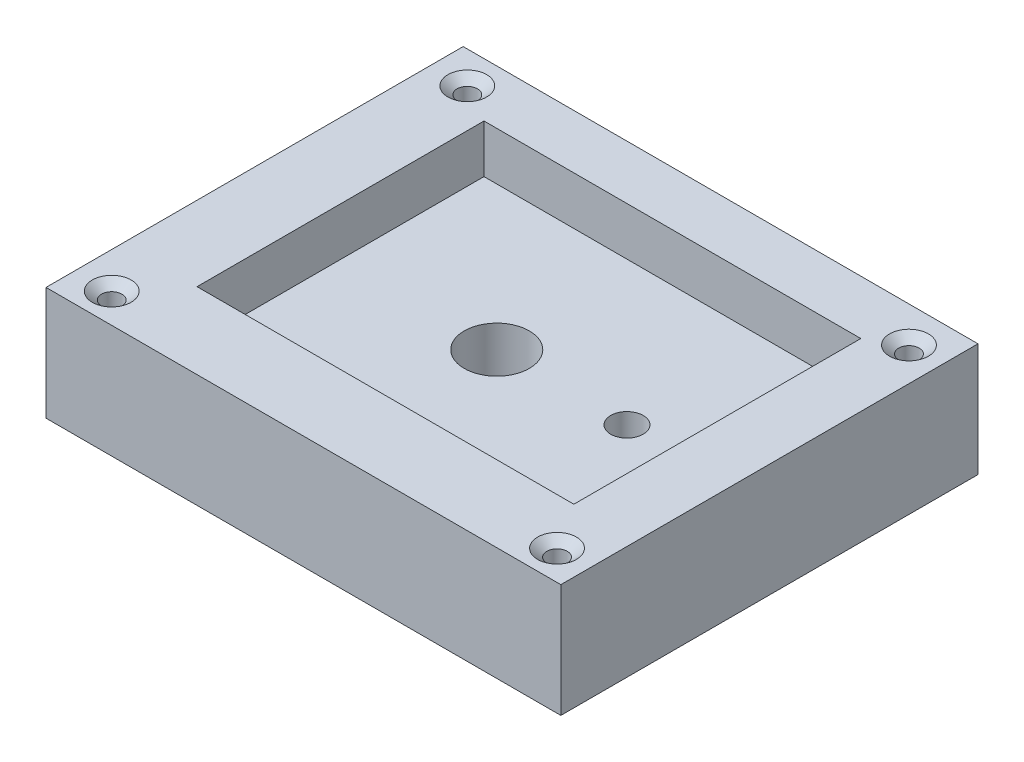
ISO-10303-21;
HEADER;
FILE_DESCRIPTION(('STEP AP214'),'2;1');
FILE_NAME('part.step','',(''),(''),'','','');
FILE_SCHEMA(('AUTOMOTIVE_DESIGN { 1 0 10303 214 1 1 1 1 }'));
ENDSEC;
DATA;
#1=APPLICATION_CONTEXT('core data for automotive mechanical design processes');
#2=APPLICATION_PROTOCOL_DEFINITION('international standard','automotive_design',2000,#1);
#3=PRODUCT_CONTEXT('',#1,'mechanical');
#4=PRODUCT('Part','Part','',(#3));
#5=PRODUCT_RELATED_PRODUCT_CATEGORY('part','',(#4));
#6=PRODUCT_DEFINITION_FORMATION('','',#4);
#7=PRODUCT_DEFINITION_CONTEXT('part definition',#1,'design');
#8=PRODUCT_DEFINITION('design','',#6,#7);
#9=PRODUCT_DEFINITION_SHAPE('','',#8);
#10=(LENGTH_UNIT() NAMED_UNIT(*) SI_UNIT(.MILLI.,.METRE.));
#11=(NAMED_UNIT(*) PLANE_ANGLE_UNIT() SI_UNIT($,.RADIAN.));
#12=(NAMED_UNIT(*) SI_UNIT($,.STERADIAN.) SOLID_ANGLE_UNIT());
#13=UNCERTAINTY_MEASURE_WITH_UNIT(LENGTH_MEASURE(1.E-05),#10,'distance_accuracy_value','');
#14=(GEOMETRIC_REPRESENTATION_CONTEXT(3) GLOBAL_UNCERTAINTY_ASSIGNED_CONTEXT((#13)) GLOBAL_UNIT_ASSIGNED_CONTEXT((#10,
#11,#12)) REPRESENTATION_CONTEXT('',''));
#15=CARTESIAN_POINT('',(0.,0.,0.));
#16=DIRECTION('',(0.,0.,1.));
#17=DIRECTION('',(1.,0.,0.));
#18=AXIS2_PLACEMENT_3D('',#15,#16,#17);
#19=CARTESIAN_POINT('',(0.,11.049,0.));
#20=DIRECTION('',(-1.,0.,0.));
#21=DIRECTION('',(0.,0.,1.));
#22=AXIS2_PLACEMENT_3D('',#19,#20,#21);
#23=PLANE('',#22);
#24=DIRECTION('',(0.,0.,-1.));
#25=VECTOR('',#24,1.);
#26=CARTESIAN_POINT('',(0.,0.,0.));
#27=LINE('',#26,#25);
#28=CARTESIAN_POINT('',(0.,0.,0.));
#29=VERTEX_POINT('',#28);
#30=CARTESIAN_POINT('',(0.,0.,-40.6908));
#31=VERTEX_POINT('',#30);
#32=EDGE_CURVE('E152',#29,#31,#27,.T.);
#33=ORIENTED_EDGE('',*,*,#32,.T.);
#34=DIRECTION('',(0.,-1.,0.));
#35=VECTOR('',#34,1.);
#36=CARTESIAN_POINT('',(0.,11.049,-40.6908));
#37=LINE('',#36,#35);
#38=CARTESIAN_POINT('',(0.,11.049,-40.6908));
#39=VERTEX_POINT('',#38);
#40=EDGE_CURVE('E11',#39,#31,#37,.T.);
#41=ORIENTED_EDGE('',*,*,#40,.F.);
#42=DIRECTION('',(0.,0.,-1.));
#43=VECTOR('',#42,1.);
#44=CARTESIAN_POINT('',(0.,11.049,0.));
#45=LINE('',#44,#43);
#46=CARTESIAN_POINT('',(0.,11.049,0.));
#47=VERTEX_POINT('',#46);
#48=EDGE_CURVE('E158',#47,#39,#45,.T.);
#49=ORIENTED_EDGE('',*,*,#48,.F.);
#50=DIRECTION('',(0.,-1.,0.));
#51=VECTOR('',#50,1.);
#52=CARTESIAN_POINT('',(0.,11.049,0.));
#53=LINE('',#52,#51);
#54=EDGE_CURVE('E163',#47,#29,#53,.T.);
#55=ORIENTED_EDGE('',*,*,#54,.T.);
#56=EDGE_LOOP('',(#33,#41,#49,#55));
#57=FACE_BOUND('',#56,.T.);
#58=ADVANCED_FACE('F43',(#57),#23,.F.);
#59=CARTESIAN_POINT('',(0.,11.049,-40.6908));
#60=DIRECTION('',(0.,0.,1.));
#61=DIRECTION('',(1.,0.,0.));
#62=AXIS2_PLACEMENT_3D('',#59,#60,#61);
#63=PLANE('',#62);
#64=DIRECTION('',(-1.,0.,0.));
#65=VECTOR('',#64,1.);
#66=CARTESIAN_POINT('',(0.,0.,-40.6908));
#67=LINE('',#66,#65);
#68=CARTESIAN_POINT('',(-50.2158,0.,-40.6908));
#69=VERTEX_POINT('',#68);
#70=EDGE_CURVE('E170',#31,#69,#67,.T.);
#71=ORIENTED_EDGE('',*,*,#70,.T.);
#72=DIRECTION('',(0.,-1.,0.));
#73=VECTOR('',#72,1.);
#74=CARTESIAN_POINT('',(-50.2158,11.049,-40.6908));
#75=LINE('',#74,#73);
#76=CARTESIAN_POINT('',(-50.2158,11.049,-40.6908));
#77=VERTEX_POINT('',#76);
#78=EDGE_CURVE('E49',#77,#69,#75,.T.);
#79=ORIENTED_EDGE('',*,*,#78,.F.);
#80=DIRECTION('',(-1.,0.,0.));
#81=VECTOR('',#80,1.);
#82=CARTESIAN_POINT('',(0.,11.049,-40.6908));
#83=LINE('',#82,#81);
#84=EDGE_CURVE('E94',#39,#77,#83,.T.);
#85=ORIENTED_EDGE('',*,*,#84,.F.);
#86=ORIENTED_EDGE('',*,*,#40,.T.);
#87=EDGE_LOOP('',(#71,#79,#85,#86));
#88=FACE_BOUND('',#87,.T.);
#89=ADVANCED_FACE('F197',(#88),#63,.F.);
#90=CARTESIAN_POINT('',(-50.2158,11.049,0.));
#91=DIRECTION('',(1.,0.,0.));
#92=DIRECTION('',(0.,0.,-1.));
#93=AXIS2_PLACEMENT_3D('',#90,#91,#92);
#94=PLANE('',#93);
#95=DIRECTION('',(0.,0.,1.));
#96=VECTOR('',#95,1.);
#97=CARTESIAN_POINT('',(-50.2158,0.,0.));
#98=LINE('',#97,#96);
#99=CARTESIAN_POINT('',(-50.2158,0.,0.));
#100=VERTEX_POINT('',#99);
#101=EDGE_CURVE('E166',#69,#100,#98,.T.);
#102=ORIENTED_EDGE('',*,*,#101,.T.);
#103=DIRECTION('',(0.,-1.,0.));
#104=VECTOR('',#103,1.);
#105=CARTESIAN_POINT('',(-50.2158,11.049,0.));
#106=LINE('',#105,#104);
#107=CARTESIAN_POINT('',(-50.2158,11.049,0.));
#108=VERTEX_POINT('',#107);
#109=EDGE_CURVE('E174',#108,#100,#106,.T.);
#110=ORIENTED_EDGE('',*,*,#109,.F.);
#111=DIRECTION('',(0.,0.,1.));
#112=VECTOR('',#111,1.);
#113=CARTESIAN_POINT('',(-50.2158,11.049,0.));
#114=LINE('',#113,#112);
#115=EDGE_CURVE('E161',#77,#108,#114,.T.);
#116=ORIENTED_EDGE('',*,*,#115,.F.);
#117=ORIENTED_EDGE('',*,*,#78,.T.);
#118=EDGE_LOOP('',(#102,#110,#116,#117));
#119=FACE_BOUND('',#118,.T.);
#120=ADVANCED_FACE('F176',(#119),#94,.F.);
#121=CARTESIAN_POINT('',(0.,11.049,0.));
#122=DIRECTION('',(0.,0.,-1.));
#123=DIRECTION('',(-1.,0.,0.));
#124=AXIS2_PLACEMENT_3D('',#121,#122,#123);
#125=PLANE('',#124);
#126=DIRECTION('',(1.,0.,0.));
#127=VECTOR('',#126,1.);
#128=CARTESIAN_POINT('',(0.,0.,0.));
#129=LINE('',#128,#127);
#130=EDGE_CURVE('E87',#100,#29,#129,.T.);
#131=ORIENTED_EDGE('',*,*,#130,.T.);
#132=ORIENTED_EDGE('',*,*,#54,.F.);
#133=DIRECTION('',(1.,0.,0.));
#134=VECTOR('',#133,1.);
#135=CARTESIAN_POINT('',(0.,11.049,0.));
#136=LINE('',#135,#134);
#137=EDGE_CURVE('E68',#108,#47,#136,.T.);
#138=ORIENTED_EDGE('',*,*,#137,.F.);
#139=ORIENTED_EDGE('',*,*,#109,.T.);
#140=EDGE_LOOP('',(#131,#132,#138,#139));
#141=FACE_BOUND('',#140,.T.);
#142=ADVANCED_FACE('F187',(#141),#125,.F.);
#143=CARTESIAN_POINT('',(0.,11.049,0.));
#144=DIRECTION('',(0.,1.,0.));
#145=DIRECTION('',(0.,0.,1.));
#146=AXIS2_PLACEMENT_3D('',#143,#144,#145);
#147=PLANE('',#146);
#148=CARTESIAN_POINT('',(-46.6966110065535,11.049,-37.5742286786535));
#149=DIRECTION('',(0.,1.,0.));
#150=DIRECTION('',(0.,0.,1.));
#151=AXIS2_PLACEMENT_3D('',#148,#149,#150);
#152=CIRCLE('',#151,1.8923);
#153=CARTESIAN_POINT('',(-46.6966110065535,11.049,-35.6819286786535));
#154=VERTEX_POINT('',#153);
#155=EDGE_CURVE('E410',#154,#154,#152,.T.);
#156=ORIENTED_EDGE('',*,*,#155,.F.);
#157=EDGE_LOOP('',(#156));
#158=FACE_BOUND('',#157,.T.);
#159=CARTESIAN_POINT('',(-3.25986513751191,11.049,-37.2176583767434));
#160=DIRECTION('',(0.,1.,0.));
#161=DIRECTION('',(0.,0.,1.));
#162=AXIS2_PLACEMENT_3D('',#159,#160,#161);
#163=CIRCLE('',#162,1.8923);
#164=CARTESIAN_POINT('',(-3.25986513751191,11.049,-35.3253583767434));
#165=VERTEX_POINT('',#164);
#166=EDGE_CURVE('E412',#165,#165,#163,.T.);
#167=ORIENTED_EDGE('',*,*,#166,.F.);
#168=EDGE_LOOP('',(#167));
#169=FACE_BOUND('',#168,.T.);
#170=CARTESIAN_POINT('',(-46.6966110065535,11.049,-2.88966294740383));
#171=DIRECTION('',(0.,1.,0.));
#172=DIRECTION('',(0.,0.,1.));
#173=AXIS2_PLACEMENT_3D('',#170,#171,#172);
#174=CIRCLE('',#173,1.8923);
#175=CARTESIAN_POINT('',(-46.6966110065535,11.049,-0.997362947403835));
#176=VERTEX_POINT('',#175);
#177=EDGE_CURVE('E421',#176,#176,#174,.T.);
#178=ORIENTED_EDGE('',*,*,#177,.F.);
#179=EDGE_LOOP('',(#178));
#180=FACE_BOUND('',#179,.T.);
#181=CARTESIAN_POINT('',(-3.25986513751191,11.049,-2.88966294740383));
#182=DIRECTION('',(0.,1.,0.));
#183=DIRECTION('',(0.,0.,1.));
#184=AXIS2_PLACEMENT_3D('',#181,#182,#183);
#185=CIRCLE('',#184,1.8923);
#186=CARTESIAN_POINT('',(-3.25986513751191,11.049,-0.997362947403835));
#187=VERTEX_POINT('',#186);
#188=EDGE_CURVE('E435',#187,#187,#185,.T.);
#189=ORIENTED_EDGE('',*,*,#188,.F.);
#190=EDGE_LOOP('',(#189));
#191=FACE_BOUND('',#190,.T.);
#192=DIRECTION('',(0.,0.,-1.));
#193=VECTOR('',#192,1.);
#194=CARTESIAN_POINT('',(-6.15850939457085,11.049,-7.42836661739355));
#195=LINE('',#194,#193);
#196=CARTESIAN_POINT('',(-6.15850939457085,11.049,-7.42836661739355));
#197=VERTEX_POINT('',#196);
#198=CARTESIAN_POINT('',(-6.15850939457085,11.049,-35.4191666173936));
#199=VERTEX_POINT('',#198);
#200=EDGE_CURVE('E60',#197,#199,#195,.T.);
#201=ORIENTED_EDGE('',*,*,#200,.F.);
#202=DIRECTION('',(-1.,0.,0.));
#203=VECTOR('',#202,1.);
#204=CARTESIAN_POINT('',(-6.15850939457085,11.049,-7.42836661739355));
#205=LINE('',#204,#203);
#206=CARTESIAN_POINT('',(-42.9123093945709,11.049,-7.42836661739355));
#207=VERTEX_POINT('',#206);
#208=EDGE_CURVE('E133',#197,#207,#205,.T.);
#209=ORIENTED_EDGE('',*,*,#208,.T.);
#210=DIRECTION('',(0.,0.,-1.));
#211=VECTOR('',#210,1.);
#212=CARTESIAN_POINT('',(-42.9123093945709,11.049,-7.42836661739355));
#213=LINE('',#212,#211);
#214=CARTESIAN_POINT('',(-42.9123093945709,11.049,-35.4191666173935));
#215=VERTEX_POINT('',#214);
#216=EDGE_CURVE('E136',#207,#215,#213,.T.);
#217=ORIENTED_EDGE('',*,*,#216,.T.);
#218=DIRECTION('',(-1.,0.,0.));
#219=VECTOR('',#218,1.);
#220=CARTESIAN_POINT('',(-6.15850939457085,11.049,-35.4191666173936));
#221=LINE('',#220,#219);
#222=EDGE_CURVE('E150',#199,#215,#221,.T.);
#223=ORIENTED_EDGE('',*,*,#222,.F.);
#224=EDGE_LOOP('',(#201,#209,#217,#223));
#225=FACE_BOUND('',#224,.T.);
#226=ORIENTED_EDGE('',*,*,#48,.T.);
#227=ORIENTED_EDGE('',*,*,#84,.T.);
#228=ORIENTED_EDGE('',*,*,#115,.T.);
#229=ORIENTED_EDGE('',*,*,#137,.T.);
#230=EDGE_LOOP('',(#226,#227,#228,#229));
#231=FACE_BOUND('',#230,.T.);
#232=ADVANCED_FACE('F189',(#158,#169,#180,#191,#225,#231),#147,.T.);
#233=CARTESIAN_POINT('',(0.,0.,0.));
#234=DIRECTION('',(0.,1.,0.));
#235=DIRECTION('',(0.,0.,1.));
#236=AXIS2_PLACEMENT_3D('',#233,#234,#235);
#237=PLANE('',#236);
#238=CARTESIAN_POINT('',(-46.6966110065535,0.,-37.5742286786535));
#239=DIRECTION('',(0.,1.,0.));
#240=DIRECTION('',(0.,0.,1.));
#241=AXIS2_PLACEMENT_3D('',#238,#239,#240);
#242=CIRCLE('',#241,0.996949999999996);
#243=CARTESIAN_POINT('',(-46.6966110065535,0.,-36.5772786786535));
#244=VERTEX_POINT('',#243);
#245=EDGE_CURVE('E406',#244,#244,#242,.T.);
#246=ORIENTED_EDGE('',*,*,#245,.T.);
#247=EDGE_LOOP('',(#246));
#248=FACE_BOUND('',#247,.T.);
#249=CARTESIAN_POINT('',(-3.25986513751191,0.,-37.2176583767434));
#250=DIRECTION('',(0.,1.,0.));
#251=DIRECTION('',(0.,0.,1.));
#252=AXIS2_PLACEMENT_3D('',#249,#250,#251);
#253=CIRCLE('',#252,0.996949999999998);
#254=CARTESIAN_POINT('',(-3.25986513751191,0.,-36.2207083767434));
#255=VERTEX_POINT('',#254);
#256=EDGE_CURVE('E419',#255,#255,#253,.T.);
#257=ORIENTED_EDGE('',*,*,#256,.T.);
#258=EDGE_LOOP('',(#257));
#259=FACE_BOUND('',#258,.T.);
#260=CARTESIAN_POINT('',(-46.6966110065535,0.,-2.88966294740383));
#261=DIRECTION('',(0.,1.,0.));
#262=DIRECTION('',(0.,0.,1.));
#263=AXIS2_PLACEMENT_3D('',#260,#261,#262);
#264=CIRCLE('',#263,0.996949999999996);
#265=CARTESIAN_POINT('',(-46.6966110065535,0.,-1.89271294740384));
#266=VERTEX_POINT('',#265);
#267=EDGE_CURVE('E427',#266,#266,#264,.T.);
#268=ORIENTED_EDGE('',*,*,#267,.T.);
#269=EDGE_LOOP('',(#268));
#270=FACE_BOUND('',#269,.T.);
#271=CARTESIAN_POINT('',(-3.25986513751191,0.,-2.88966294740383));
#272=DIRECTION('',(0.,1.,0.));
#273=DIRECTION('',(0.,0.,1.));
#274=AXIS2_PLACEMENT_3D('',#271,#272,#273);
#275=CIRCLE('',#274,0.996949999999998);
#276=CARTESIAN_POINT('',(-3.25986513751191,0.,-1.89271294740384));
#277=VERTEX_POINT('',#276);
#278=EDGE_CURVE('E437',#277,#277,#275,.T.);
#279=ORIENTED_EDGE('',*,*,#278,.T.);
#280=EDGE_LOOP('',(#279));
#281=FACE_BOUND('',#280,.T.);
#282=CARTESIAN_POINT('',(-27.6723093945709,0.,-21.4237666173935));
#283=DIRECTION('',(0.,1.,0.));
#284=DIRECTION('',(0.,0.,1.));
#285=AXIS2_PLACEMENT_3D('',#282,#283,#284);
#286=CIRCLE('',#285,3.175);
#287=CARTESIAN_POINT('',(-27.6723093945709,0.,-18.2487666173935));
#288=VERTEX_POINT('',#287);
#289=EDGE_CURVE('E146',#288,#288,#286,.T.);
#290=ORIENTED_EDGE('',*,*,#289,.T.);
#291=EDGE_LOOP('',(#290));
#292=FACE_BOUND('',#291,.T.);
#293=CARTESIAN_POINT('',(-14.9723093945709,0.,-21.4237666173935));
#294=DIRECTION('',(0.,1.,0.));
#295=DIRECTION('',(0.,0.,1.));
#296=AXIS2_PLACEMENT_3D('',#293,#294,#295);
#297=CIRCLE('',#296,1.5875);
#298=CARTESIAN_POINT('',(-14.9723093945709,0.,-19.8362666173935));
#299=VERTEX_POINT('',#298);
#300=EDGE_CURVE('E143',#299,#299,#297,.T.);
#301=ORIENTED_EDGE('',*,*,#300,.T.);
#302=EDGE_LOOP('',(#301));
#303=FACE_BOUND('',#302,.T.);
#304=ORIENTED_EDGE('',*,*,#32,.F.);
#305=ORIENTED_EDGE('',*,*,#130,.F.);
#306=ORIENTED_EDGE('',*,*,#101,.F.);
#307=ORIENTED_EDGE('',*,*,#70,.F.);
#308=EDGE_LOOP('',(#304,#305,#306,#307));
#309=FACE_BOUND('',#308,.T.);
#310=ADVANCED_FACE('F185',(#248,#259,#270,#281,#292,#303,#309),#237,.F.);
#311=CARTESIAN_POINT('',(-6.15850939457085,6.35,-7.42836661739355));
#312=DIRECTION('',(1.,0.,0.));
#313=DIRECTION('',(0.,0.,-1.));
#314=AXIS2_PLACEMENT_3D('',#311,#312,#313);
#315=PLANE('',#314);
#316=ORIENTED_EDGE('',*,*,#200,.T.);
#317=DIRECTION('',(0.,1.,0.));
#318=VECTOR('',#317,1.);
#319=CARTESIAN_POINT('',(-6.15850939457085,6.35,-35.4191666173936));
#320=LINE('',#319,#318);
#321=CARTESIAN_POINT('',(-6.15850939457085,6.35,-35.4191666173936));
#322=VERTEX_POINT('',#321);
#323=EDGE_CURVE('E111',#322,#199,#320,.T.);
#324=ORIENTED_EDGE('',*,*,#323,.F.);
#325=DIRECTION('',(0.,0.,-1.));
#326=VECTOR('',#325,1.);
#327=CARTESIAN_POINT('',(-6.15850939457085,6.35,-7.42836661739355));
#328=LINE('',#327,#326);
#329=CARTESIAN_POINT('',(-6.15850939457085,6.35,-7.42836661739355));
#330=VERTEX_POINT('',#329);
#331=EDGE_CURVE('E119',#330,#322,#328,.T.);
#332=ORIENTED_EDGE('',*,*,#331,.F.);
#333=DIRECTION('',(0.,1.,0.));
#334=VECTOR('',#333,1.);
#335=CARTESIAN_POINT('',(-6.15850939457085,6.35,-7.42836661739355));
#336=LINE('',#335,#334);
#337=EDGE_CURVE('E155',#330,#197,#336,.T.);
#338=ORIENTED_EDGE('',*,*,#337,.T.);
#339=EDGE_LOOP('',(#316,#324,#332,#338));
#340=FACE_BOUND('',#339,.T.);
#341=ADVANCED_FACE('F117',(#340),#315,.F.);
#342=CARTESIAN_POINT('',(-6.15850939457085,6.35,-7.42836661739355));
#343=DIRECTION('',(0.,0.,-1.));
#344=DIRECTION('',(-1.,0.,0.));
#345=AXIS2_PLACEMENT_3D('',#342,#343,#344);
#346=PLANE('',#345);
#347=ORIENTED_EDGE('',*,*,#208,.F.);
#348=ORIENTED_EDGE('',*,*,#337,.F.);
#349=DIRECTION('',(-1.,0.,0.));
#350=VECTOR('',#349,1.);
#351=CARTESIAN_POINT('',(-6.15850939457085,6.35,-7.42836661739355));
#352=LINE('',#351,#350);
#353=CARTESIAN_POINT('',(-42.9123093945709,6.35,-7.42836661739355));
#354=VERTEX_POINT('',#353);
#355=EDGE_CURVE('E121',#330,#354,#352,.T.);
#356=ORIENTED_EDGE('',*,*,#355,.T.);
#357=DIRECTION('',(0.,1.,0.));
#358=VECTOR('',#357,1.);
#359=CARTESIAN_POINT('',(-42.9123093945709,6.35,-7.42836661739355));
#360=LINE('',#359,#358);
#361=EDGE_CURVE('E154',#354,#207,#360,.T.);
#362=ORIENTED_EDGE('',*,*,#361,.T.);
#363=EDGE_LOOP('',(#347,#348,#356,#362));
#364=FACE_BOUND('',#363,.T.);
#365=ADVANCED_FACE('F238',(#364),#346,.T.);
#366=CARTESIAN_POINT('',(-42.9123093945709,6.35,-7.42836661739355));
#367=DIRECTION('',(1.,0.,0.));
#368=DIRECTION('',(0.,0.,-1.));
#369=AXIS2_PLACEMENT_3D('',#366,#367,#368);
#370=PLANE('',#369);
#371=ORIENTED_EDGE('',*,*,#216,.F.);
#372=ORIENTED_EDGE('',*,*,#361,.F.);
#373=DIRECTION('',(0.,0.,-1.));
#374=VECTOR('',#373,1.);
#375=CARTESIAN_POINT('',(-42.9123093945709,6.35,-7.42836661739355));
#376=LINE('',#375,#374);
#377=CARTESIAN_POINT('',(-42.9123093945709,6.35,-35.4191666173935));
#378=VERTEX_POINT('',#377);
#379=EDGE_CURVE('E132',#354,#378,#376,.T.);
#380=ORIENTED_EDGE('',*,*,#379,.T.);
#381=DIRECTION('',(0.,1.,0.));
#382=VECTOR('',#381,1.);
#383=CARTESIAN_POINT('',(-42.9123093945709,6.35,-35.4191666173935));
#384=LINE('',#383,#382);
#385=EDGE_CURVE('E125',#378,#215,#384,.T.);
#386=ORIENTED_EDGE('',*,*,#385,.T.);
#387=EDGE_LOOP('',(#371,#372,#380,#386));
#388=FACE_BOUND('',#387,.T.);
#389=ADVANCED_FACE('F247',(#388),#370,.T.);
#390=CARTESIAN_POINT('',(-6.15850939457085,6.35,-35.4191666173936));
#391=DIRECTION('',(0.,0.,-1.));
#392=DIRECTION('',(-1.,0.,0.));
#393=AXIS2_PLACEMENT_3D('',#390,#391,#392);
#394=PLANE('',#393);
#395=ORIENTED_EDGE('',*,*,#222,.T.);
#396=ORIENTED_EDGE('',*,*,#385,.F.);
#397=DIRECTION('',(-1.,0.,0.));
#398=VECTOR('',#397,1.);
#399=CARTESIAN_POINT('',(-6.15850939457085,6.35,-35.4191666173936));
#400=LINE('',#399,#398);
#401=EDGE_CURVE('E130',#322,#378,#400,.T.);
#402=ORIENTED_EDGE('',*,*,#401,.F.);
#403=ORIENTED_EDGE('',*,*,#323,.T.);
#404=EDGE_LOOP('',(#395,#396,#402,#403));
#405=FACE_BOUND('',#404,.T.);
#406=ADVANCED_FACE('F126',(#405),#394,.F.);
#407=CARTESIAN_POINT('',(0.,6.35,0.));
#408=DIRECTION('',(0.,1.,0.));
#409=DIRECTION('',(0.,0.,1.));
#410=AXIS2_PLACEMENT_3D('',#407,#408,#409);
#411=PLANE('',#410);
#412=CARTESIAN_POINT('',(-27.6723093945709,6.35,-21.4237666173935));
#413=DIRECTION('',(0.,1.,0.));
#414=DIRECTION('',(0.,0.,1.));
#415=AXIS2_PLACEMENT_3D('',#412,#413,#414);
#416=CIRCLE('',#415,3.175);
#417=CARTESIAN_POINT('',(-27.6723093945709,6.35,-18.2487666173935));
#418=VERTEX_POINT('',#417);
#419=EDGE_CURVE('E444',#418,#418,#416,.T.);
#420=ORIENTED_EDGE('',*,*,#419,.F.);
#421=EDGE_LOOP('',(#420));
#422=FACE_BOUND('',#421,.T.);
#423=CARTESIAN_POINT('',(-14.9723093945709,6.35,-21.4237666173935));
#424=DIRECTION('',(0.,1.,0.));
#425=DIRECTION('',(0.,0.,1.));
#426=AXIS2_PLACEMENT_3D('',#423,#424,#425);
#427=CIRCLE('',#426,1.5875);
#428=CARTESIAN_POINT('',(-14.9723093945709,6.35,-19.8362666173935));
#429=VERTEX_POINT('',#428);
#430=EDGE_CURVE('E443',#429,#429,#427,.T.);
#431=ORIENTED_EDGE('',*,*,#430,.F.);
#432=EDGE_LOOP('',(#431));
#433=FACE_BOUND('',#432,.T.);
#434=ORIENTED_EDGE('',*,*,#331,.T.);
#435=ORIENTED_EDGE('',*,*,#401,.T.);
#436=ORIENTED_EDGE('',*,*,#379,.F.);
#437=ORIENTED_EDGE('',*,*,#355,.F.);
#438=EDGE_LOOP('',(#434,#435,#436,#437));
#439=FACE_BOUND('',#438,.T.);
#440=ADVANCED_FACE('F131',(#422,#433,#439),#411,.T.);
#441=CARTESIAN_POINT('',(-14.9723093945709,0.,-21.4237666173935));
#442=DIRECTION('',(0.,1.,0.));
#443=DIRECTION('',(0.,0.,1.));
#444=AXIS2_PLACEMENT_3D('',#441,#442,#443);
#445=CYLINDRICAL_SURFACE('',#444,1.5875);
#446=ORIENTED_EDGE('',*,*,#300,.F.);
#447=EDGE_LOOP('',(#446));
#448=FACE_BOUND('',#447,.T.);
#449=ORIENTED_EDGE('',*,*,#430,.T.);
#450=EDGE_LOOP('',(#449));
#451=FACE_BOUND('',#450,.T.);
#452=ADVANCED_FACE('F277',(#448,#451),#445,.F.);
#453=CARTESIAN_POINT('',(-27.6723093945709,0.,-21.4237666173935));
#454=DIRECTION('',(0.,1.,0.));
#455=DIRECTION('',(0.,0.,1.));
#456=AXIS2_PLACEMENT_3D('',#453,#454,#455);
#457=CYLINDRICAL_SURFACE('',#456,3.175);
#458=ORIENTED_EDGE('',*,*,#289,.F.);
#459=EDGE_LOOP('',(#458));
#460=FACE_BOUND('',#459,.T.);
#461=ORIENTED_EDGE('',*,*,#419,.T.);
#462=EDGE_LOOP('',(#461));
#463=FACE_BOUND('',#462,.T.);
#464=ADVANCED_FACE('F288',(#460,#463),#457,.F.);
#465=CARTESIAN_POINT('',(-3.25986513751191,11.049,-2.88966294740383));
#466=DIRECTION('',(0.,1.,0.));
#467=DIRECTION('',(0.,0.,1.));
#468=AXIS2_PLACEMENT_3D('',#465,#466,#467);
#469=CYLINDRICAL_SURFACE('',#468,0.996949999999998);
#470=ORIENTED_EDGE('',*,*,#278,.F.);
#471=EDGE_LOOP('',(#470));
#472=FACE_BOUND('',#471,.T.);
#473=CARTESIAN_POINT('',(-3.25986513751191,10.2977121452254,-2.88966294740383));
#474=DIRECTION('',(0.,1.,0.));
#475=DIRECTION('',(0.,0.,1.));
#476=AXIS2_PLACEMENT_3D('',#473,#474,#475);
#477=CIRCLE('',#476,0.996949999999999);
#478=CARTESIAN_POINT('',(-3.25986513751191,10.2977121452254,-1.89271294740384));
#479=VERTEX_POINT('',#478);
#480=EDGE_CURVE('E434',#479,#479,#477,.T.);
#481=ORIENTED_EDGE('',*,*,#480,.T.);
#482=EDGE_LOOP('',(#481));
#483=FACE_BOUND('',#482,.T.);
#484=ADVANCED_FACE('F293',(#472,#483),#469,.F.);
#485=CARTESIAN_POINT('',(-3.25986513751191,11.049,-2.88966294740383));
#486=DIRECTION('',(0.,1.,0.));
#487=DIRECTION('',(0.,0.,1.));
#488=AXIS2_PLACEMENT_3D('',#485,#486,#487);
#489=CONICAL_SURFACE('',#488,1.8923,0.872664625997164);
#490=ORIENTED_EDGE('',*,*,#480,.F.);
#491=EDGE_LOOP('',(#490));
#492=FACE_BOUND('',#491,.T.);
#493=ORIENTED_EDGE('',*,*,#188,.T.);
#494=EDGE_LOOP('',(#493));
#495=FACE_BOUND('',#494,.T.);
#496=ADVANCED_FACE('F304',(#492,#495),#489,.F.);
#497=CARTESIAN_POINT('',(-46.6966110065535,11.049,-2.88966294740383));
#498=DIRECTION('',(0.,1.,0.));
#499=DIRECTION('',(0.,0.,1.));
#500=AXIS2_PLACEMENT_3D('',#497,#498,#499);
#501=CYLINDRICAL_SURFACE('',#500,0.996949999999996);
#502=ORIENTED_EDGE('',*,*,#267,.F.);
#503=EDGE_LOOP('',(#502));
#504=FACE_BOUND('',#503,.T.);
#505=CARTESIAN_POINT('',(-46.6966110065535,10.2977121452254,-2.88966294740383));
#506=DIRECTION('',(0.,1.,0.));
#507=DIRECTION('',(0.,0.,1.));
#508=AXIS2_PLACEMENT_3D('',#505,#506,#507);
#509=CIRCLE('',#508,0.996949999999996);
#510=CARTESIAN_POINT('',(-46.6966110065535,10.2977121452254,-1.89271294740384));
#511=VERTEX_POINT('',#510);
#512=EDGE_CURVE('E426',#511,#511,#509,.T.);
#513=ORIENTED_EDGE('',*,*,#512,.T.);
#514=EDGE_LOOP('',(#513));
#515=FACE_BOUND('',#514,.T.);
#516=ADVANCED_FACE('F320',(#504,#515),#501,.F.);
#517=CARTESIAN_POINT('',(-46.6966110065535,11.049,-2.88966294740383));
#518=DIRECTION('',(0.,1.,0.));
#519=DIRECTION('',(0.,0.,1.));
#520=AXIS2_PLACEMENT_3D('',#517,#518,#519);
#521=CONICAL_SURFACE('',#520,1.8923,0.872664625997166);
#522=ORIENTED_EDGE('',*,*,#512,.F.);
#523=EDGE_LOOP('',(#522));
#524=FACE_BOUND('',#523,.T.);
#525=ORIENTED_EDGE('',*,*,#177,.T.);
#526=EDGE_LOOP('',(#525));
#527=FACE_BOUND('',#526,.T.);
#528=ADVANCED_FACE('F327',(#524,#527),#521,.F.);
#529=CARTESIAN_POINT('',(-3.25986513751191,11.049,-37.2176583767434));
#530=DIRECTION('',(0.,1.,0.));
#531=DIRECTION('',(0.,0.,1.));
#532=AXIS2_PLACEMENT_3D('',#529,#530,#531);
#533=CYLINDRICAL_SURFACE('',#532,0.996949999999998);
#534=ORIENTED_EDGE('',*,*,#256,.F.);
#535=EDGE_LOOP('',(#534));
#536=FACE_BOUND('',#535,.T.);
#537=CARTESIAN_POINT('',(-3.25986513751191,10.2977121452254,-37.2176583767434));
#538=DIRECTION('',(0.,1.,0.));
#539=DIRECTION('',(0.,0.,1.));
#540=AXIS2_PLACEMENT_3D('',#537,#538,#539);
#541=CIRCLE('',#540,0.996949999999999);
#542=CARTESIAN_POINT('',(-3.25986513751191,10.2977121452254,-36.2207083767434));
#543=VERTEX_POINT('',#542);
#544=EDGE_CURVE('E417',#543,#543,#541,.T.);
#545=ORIENTED_EDGE('',*,*,#544,.T.);
#546=EDGE_LOOP('',(#545));
#547=FACE_BOUND('',#546,.T.);
#548=ADVANCED_FACE('F338',(#536,#547),#533,.F.);
#549=CARTESIAN_POINT('',(-3.25986513751191,11.049,-37.2176583767434));
#550=DIRECTION('',(0.,1.,0.));
#551=DIRECTION('',(0.,0.,1.));
#552=AXIS2_PLACEMENT_3D('',#549,#550,#551);
#553=CONICAL_SURFACE('',#552,1.8923,0.872664625997164);
#554=ORIENTED_EDGE('',*,*,#544,.F.);
#555=EDGE_LOOP('',(#554));
#556=FACE_BOUND('',#555,.T.);
#557=ORIENTED_EDGE('',*,*,#166,.T.);
#558=EDGE_LOOP('',(#557));
#559=FACE_BOUND('',#558,.T.);
#560=ADVANCED_FACE('F352',(#556,#559),#553,.F.);
#561=CARTESIAN_POINT('',(-46.6966110065535,11.049,-37.5742286786535));
#562=DIRECTION('',(0.,1.,0.));
#563=DIRECTION('',(0.,0.,1.));
#564=AXIS2_PLACEMENT_3D('',#561,#562,#563);
#565=CYLINDRICAL_SURFACE('',#564,0.996949999999996);
#566=ORIENTED_EDGE('',*,*,#245,.F.);
#567=EDGE_LOOP('',(#566));
#568=FACE_BOUND('',#567,.T.);
#569=CARTESIAN_POINT('',(-46.6966110065535,10.2977121452254,-37.5742286786535));
#570=DIRECTION('',(0.,1.,0.));
#571=DIRECTION('',(0.,0.,1.));
#572=AXIS2_PLACEMENT_3D('',#569,#570,#571);
#573=CIRCLE('',#572,0.996949999999996);
#574=CARTESIAN_POINT('',(-46.6966110065535,10.2977121452254,-36.5772786786535));
#575=VERTEX_POINT('',#574);
#576=EDGE_CURVE('E404',#575,#575,#573,.T.);
#577=ORIENTED_EDGE('',*,*,#576,.T.);
#578=EDGE_LOOP('',(#577));
#579=FACE_BOUND('',#578,.T.);
#580=ADVANCED_FACE('F361',(#568,#579),#565,.F.);
#581=CARTESIAN_POINT('',(-46.6966110065535,11.049,-37.5742286786535));
#582=DIRECTION('',(0.,1.,0.));
#583=DIRECTION('',(0.,0.,1.));
#584=AXIS2_PLACEMENT_3D('',#581,#582,#583);
#585=CONICAL_SURFACE('',#584,1.8923,0.872664625997166);
#586=ORIENTED_EDGE('',*,*,#576,.F.);
#587=EDGE_LOOP('',(#586));
#588=FACE_BOUND('',#587,.T.);
#589=ORIENTED_EDGE('',*,*,#155,.T.);
#590=EDGE_LOOP('',(#589));
#591=FACE_BOUND('',#590,.T.);
#592=ADVANCED_FACE('F372',(#588,#591),#585,.F.);
#593=CLOSED_SHELL('',(#58,#89,#120,#142,#232,#310,#341,#365,#389,#406,#440,#452,#464,#484,#496,
#516,#528,#548,#560,#580,#592));
#594=MANIFOLD_SOLID_BREP('B2',#593);
#595=ADVANCED_BREP_SHAPE_REPRESENTATION('',(#18,#594),#14);
#596=SHAPE_DEFINITION_REPRESENTATION(#9,#595);
ENDSEC;
END-ISO-10303-21;
